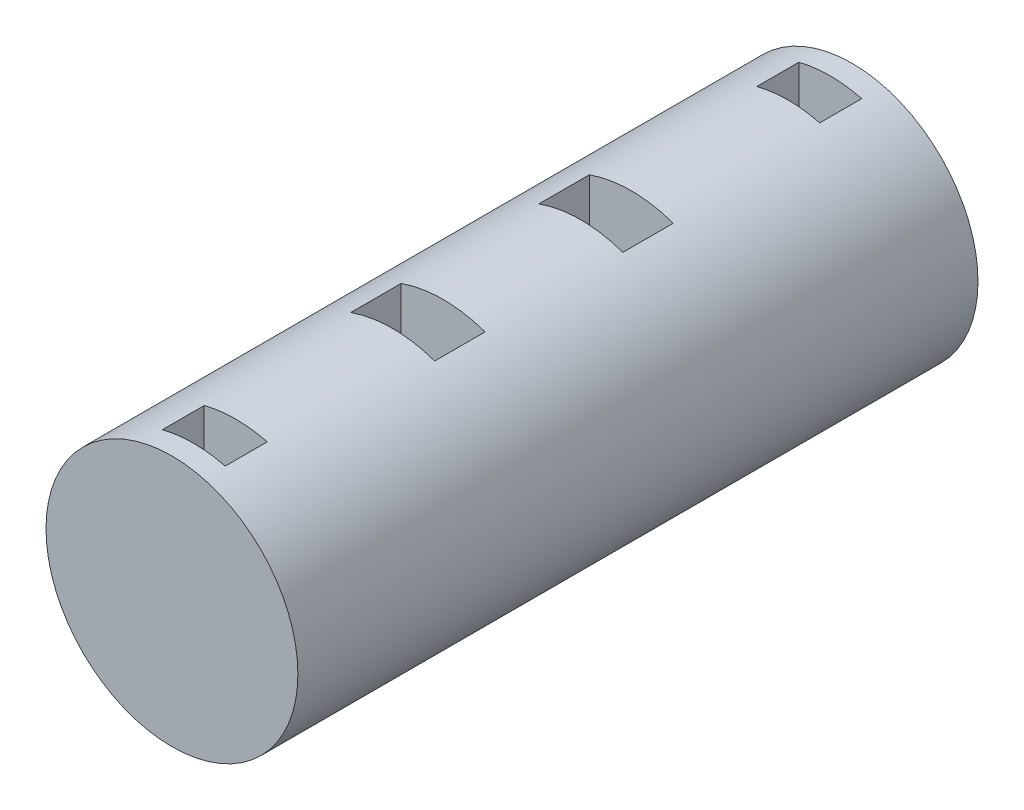
ISO-10303-21;
HEADER;
FILE_DESCRIPTION(('STEP AP214'),'2;1');
FILE_NAME('part.step','',(''),(''),'','','');
FILE_SCHEMA(('AUTOMOTIVE_DESIGN { 1 0 10303 214 1 1 1 1 }'));
ENDSEC;
DATA;
#1=APPLICATION_CONTEXT('core data for automotive mechanical design processes');
#2=APPLICATION_PROTOCOL_DEFINITION('international standard','automotive_design',2000,#1);
#3=PRODUCT_CONTEXT('',#1,'mechanical');
#4=PRODUCT('Part','Part','',(#3));
#5=PRODUCT_RELATED_PRODUCT_CATEGORY('part','',(#4));
#6=PRODUCT_DEFINITION_FORMATION('','',#4);
#7=PRODUCT_DEFINITION_CONTEXT('part definition',#1,'design');
#8=PRODUCT_DEFINITION('design','',#6,#7);
#9=PRODUCT_DEFINITION_SHAPE('','',#8);
#10=(LENGTH_UNIT() NAMED_UNIT(*) SI_UNIT(.MILLI.,.METRE.));
#11=(NAMED_UNIT(*) PLANE_ANGLE_UNIT() SI_UNIT($,.RADIAN.));
#12=(NAMED_UNIT(*) SI_UNIT($,.STERADIAN.) SOLID_ANGLE_UNIT());
#13=UNCERTAINTY_MEASURE_WITH_UNIT(LENGTH_MEASURE(1.E-05),#10,'distance_accuracy_value','');
#14=(GEOMETRIC_REPRESENTATION_CONTEXT(3) GLOBAL_UNCERTAINTY_ASSIGNED_CONTEXT((#13)) GLOBAL_UNIT_ASSIGNED_CONTEXT((#10,
#11,#12)) REPRESENTATION_CONTEXT('',''));
#15=CARTESIAN_POINT('',(0.,0.,0.));
#16=DIRECTION('',(0.,0.,1.));
#17=DIRECTION('',(1.,0.,0.));
#18=AXIS2_PLACEMENT_3D('',#15,#16,#17);
#19=CARTESIAN_POINT('',(0.,0.,81.));
#20=DIRECTION('',(0.,0.,-1.));
#21=DIRECTION('',(-1.,0.,0.));
#22=AXIS2_PLACEMENT_3D('',#19,#20,#21);
#23=CYLINDRICAL_SURFACE('',#22,30.);
#24=CARTESIAN_POINT('',(0.,0.,65.8065199589769));
#25=DIRECTION('',(0.,0.,-1.));
#26=DIRECTION('',(-1.,0.,0.));
#27=AXIS2_PLACEMENT_3D('',#24,#25,#26);
#28=CIRCLE('',#27,30.);
#29=CARTESIAN_POINT('',(-7.49999999999999,29.0473750965556,65.8065199589769));
#30=VERTEX_POINT('',#29);
#31=CARTESIAN_POINT('',(7.50000000000001,29.0473750965556,65.8065199589769));
#32=VERTEX_POINT('',#31);
#33=EDGE_CURVE('E240',#30,#32,#28,.T.);
#34=ORIENTED_EDGE('',*,*,#33,.T.);
#35=DIRECTION('',(0.,0.,-1.));
#36=VECTOR('',#35,1.);
#37=CARTESIAN_POINT('',(7.50000000000001,29.0473750965556,81.));
#38=LINE('',#37,#36);
#39=CARTESIAN_POINT('',(7.50000000000001,29.0473750965556,75.8065199589769));
#40=VERTEX_POINT('',#39);
#41=EDGE_CURVE('E11',#32,#40,#38,.F.);
#42=ORIENTED_EDGE('',*,*,#41,.T.);
#43=CARTESIAN_POINT('',(0.,0.,75.8065199589769));
#44=DIRECTION('',(0.,0.,1.));
#45=DIRECTION('',(1.,0.,0.));
#46=AXIS2_PLACEMENT_3D('',#43,#44,#45);
#47=CIRCLE('',#46,30.);
#48=CARTESIAN_POINT('',(-7.49999999999999,29.0473750965556,75.8065199589769));
#49=VERTEX_POINT('',#48);
#50=EDGE_CURVE('E49',#40,#49,#47,.T.);
#51=ORIENTED_EDGE('',*,*,#50,.T.);
#52=DIRECTION('',(0.,0.,-1.));
#53=VECTOR('',#52,1.);
#54=CARTESIAN_POINT('',(-7.49999999999999,29.0473750965556,81.));
#55=LINE('',#54,#53);
#56=EDGE_CURVE('E248',#49,#30,#55,.T.);
#57=ORIENTED_EDGE('',*,*,#56,.T.);
#58=EDGE_LOOP('',(#34,#42,#51,#57));
#59=FACE_BOUND('',#58,.T.);
#60=CARTESIAN_POINT('',(-7.49999999999999,-29.0473750965556,75.8065199589769));
#61=VERTEX_POINT('',#60);
#62=CARTESIAN_POINT('',(7.50000000000001,-29.0473750965556,75.8065199589769));
#63=VERTEX_POINT('',#62);
#64=EDGE_CURVE('E243',#61,#63,#47,.T.);
#65=ORIENTED_EDGE('',*,*,#64,.T.);
#66=DIRECTION('',(0.,0.,-1.));
#67=VECTOR('',#66,1.);
#68=CARTESIAN_POINT('',(7.50000000000001,-29.0473750965556,81.));
#69=LINE('',#68,#67);
#70=CARTESIAN_POINT('',(7.50000000000001,-29.0473750965556,65.8065199589769));
#71=VERTEX_POINT('',#70);
#72=EDGE_CURVE('E246',#63,#71,#69,.T.);
#73=ORIENTED_EDGE('',*,*,#72,.T.);
#74=CARTESIAN_POINT('',(-7.49999999999999,-29.0473750965556,65.8065199589769));
#75=VERTEX_POINT('',#74);
#76=EDGE_CURVE('E236',#71,#75,#28,.T.);
#77=ORIENTED_EDGE('',*,*,#76,.T.);
#78=DIRECTION('',(0.,0.,-1.));
#79=VECTOR('',#78,1.);
#80=CARTESIAN_POINT('',(-7.49999999999999,-29.0473750965556,81.));
#81=LINE('',#80,#79);
#82=EDGE_CURVE('E239',#75,#61,#81,.F.);
#83=ORIENTED_EDGE('',*,*,#82,.T.);
#84=EDGE_LOOP('',(#65,#73,#77,#83));
#85=FACE_BOUND('',#84,.T.);
#86=DIRECTION('',(0.,0.,-1.));
#87=VECTOR('',#86,1.);
#88=CARTESIAN_POINT('',(-10.,-28.2842712474619,81.));
#89=LINE('',#88,#87);
#90=CARTESIAN_POINT('',(-10.,-28.2842712474619,28.4117050793827));
#91=VERTEX_POINT('',#90);
#92=CARTESIAN_POINT('',(-10.,-28.2842712474619,16.4117050793827));
#93=VERTEX_POINT('',#92);
#94=EDGE_CURVE('E234',#91,#93,#89,.T.);
#95=ORIENTED_EDGE('',*,*,#94,.F.);
#96=CARTESIAN_POINT('',(0.,0.,28.4117050793827));
#97=DIRECTION('',(0.,0.,1.));
#98=DIRECTION('',(1.,0.,0.));
#99=AXIS2_PLACEMENT_3D('',#96,#97,#98);
#100=CIRCLE('',#99,30.);
#101=CARTESIAN_POINT('',(10.,-28.2842712474619,28.4117050793827));
#102=VERTEX_POINT('',#101);
#103=EDGE_CURVE('E231',#91,#102,#100,.T.);
#104=ORIENTED_EDGE('',*,*,#103,.T.);
#105=DIRECTION('',(0.,0.,-1.));
#106=VECTOR('',#105,1.);
#107=CARTESIAN_POINT('',(10.,-28.2842712474619,81.));
#108=LINE('',#107,#106);
#109=CARTESIAN_POINT('',(10.,-28.2842712474619,16.4117050793827));
#110=VERTEX_POINT('',#109);
#111=EDGE_CURVE('E230',#102,#110,#108,.T.);
#112=ORIENTED_EDGE('',*,*,#111,.T.);
#113=CARTESIAN_POINT('',(0.,0.,16.4117050793827));
#114=DIRECTION('',(0.,0.,1.));
#115=DIRECTION('',(1.,0.,0.));
#116=AXIS2_PLACEMENT_3D('',#113,#114,#115);
#117=CIRCLE('',#116,30.);
#118=EDGE_CURVE('E225',#93,#110,#117,.T.);
#119=ORIENTED_EDGE('',*,*,#118,.F.);
#120=EDGE_LOOP('',(#95,#104,#112,#119));
#121=FACE_BOUND('',#120,.T.);
#122=DIRECTION('',(0.,0.,-1.));
#123=VECTOR('',#122,1.);
#124=CARTESIAN_POINT('',(10.,28.2842712474619,81.));
#125=LINE('',#124,#123);
#126=CARTESIAN_POINT('',(10.,28.2842712474619,16.4117050793827));
#127=VERTEX_POINT('',#126);
#128=CARTESIAN_POINT('',(10.,28.2842712474619,28.4117050793827));
#129=VERTEX_POINT('',#128);
#130=EDGE_CURVE('E219',#127,#129,#125,.F.);
#131=ORIENTED_EDGE('',*,*,#130,.T.);
#132=CARTESIAN_POINT('',(-10.,28.2842712474619,28.4117050793827));
#133=VERTEX_POINT('',#132);
#134=EDGE_CURVE('E227',#129,#133,#100,.T.);
#135=ORIENTED_EDGE('',*,*,#134,.T.);
#136=DIRECTION('',(0.,0.,-1.));
#137=VECTOR('',#136,1.);
#138=CARTESIAN_POINT('',(-10.,28.2842712474619,81.));
#139=LINE('',#138,#137);
#140=CARTESIAN_POINT('',(-10.,28.2842712474619,16.4117050793827));
#141=VERTEX_POINT('',#140);
#142=EDGE_CURVE('E224',#141,#133,#139,.F.);
#143=ORIENTED_EDGE('',*,*,#142,.F.);
#144=EDGE_CURVE('E222',#127,#141,#117,.T.);
#145=ORIENTED_EDGE('',*,*,#144,.F.);
#146=EDGE_LOOP('',(#131,#135,#143,#145));
#147=FACE_BOUND('',#146,.T.);
#148=CARTESIAN_POINT('',(0.,0.,81.));
#149=DIRECTION('',(0.,0.,1.));
#150=DIRECTION('',(1.,0.,0.));
#151=AXIS2_PLACEMENT_3D('',#148,#149,#150);
#152=CIRCLE('',#151,30.);
#153=CARTESIAN_POINT('',(30.,0.,81.));
#154=VERTEX_POINT('',#153);
#155=EDGE_CURVE('E209',#154,#154,#152,.T.);
#156=ORIENTED_EDGE('',*,*,#155,.F.);
#157=EDGE_LOOP('',(#156));
#158=FACE_BOUND('',#157,.T.);
#159=CARTESIAN_POINT('',(0.,0.,-65.8065199589769));
#160=DIRECTION('',(0.,0.,-1.));
#161=DIRECTION('',(-1.,0.,0.));
#162=AXIS2_PLACEMENT_3D('',#159,#160,#161);
#163=CIRCLE('',#162,30.);
#164=CARTESIAN_POINT('',(-7.49999999999999,29.0473750965556,-65.8065199589769));
#165=VERTEX_POINT('',#164);
#166=CARTESIAN_POINT('',(7.50000000000001,29.0473750965556,-65.8065199589769));
#167=VERTEX_POINT('',#166);
#168=EDGE_CURVE('E160',#165,#167,#163,.T.);
#169=ORIENTED_EDGE('',*,*,#168,.F.);
#170=DIRECTION('',(0.,0.,1.));
#171=VECTOR('',#170,1.);
#172=CARTESIAN_POINT('',(-7.49999999999999,29.0473750965556,-81.));
#173=LINE('',#172,#171);
#174=CARTESIAN_POINT('',(-7.49999999999999,29.0473750965556,-75.8065199589769));
#175=VERTEX_POINT('',#174);
#176=EDGE_CURVE('E186',#175,#165,#173,.T.);
#177=ORIENTED_EDGE('',*,*,#176,.F.);
#178=CARTESIAN_POINT('',(0.,0.,-75.8065199589769));
#179=DIRECTION('',(0.,0.,1.));
#180=DIRECTION('',(1.,0.,0.));
#181=AXIS2_PLACEMENT_3D('',#178,#179,#180);
#182=CIRCLE('',#181,30.);
#183=CARTESIAN_POINT('',(7.50000000000001,29.0473750965556,-75.8065199589769));
#184=VERTEX_POINT('',#183);
#185=EDGE_CURVE('E188',#184,#175,#182,.T.);
#186=ORIENTED_EDGE('',*,*,#185,.F.);
#187=DIRECTION('',(0.,0.,1.));
#188=VECTOR('',#187,1.);
#189=CARTESIAN_POINT('',(7.50000000000001,29.0473750965556,-81.));
#190=LINE('',#189,#188);
#191=EDGE_CURVE('E193',#167,#184,#190,.F.);
#192=ORIENTED_EDGE('',*,*,#191,.F.);
#193=EDGE_LOOP('',(#169,#177,#186,#192));
#194=FACE_BOUND('',#193,.T.);
#195=CARTESIAN_POINT('',(-7.49999999999999,-29.0473750965556,-75.8065199589769));
#196=VERTEX_POINT('',#195);
#197=CARTESIAN_POINT('',(7.50000000000001,-29.0473750965556,-75.8065199589769));
#198=VERTEX_POINT('',#197);
#199=EDGE_CURVE('E173',#196,#198,#182,.T.);
#200=ORIENTED_EDGE('',*,*,#199,.F.);
#201=DIRECTION('',(0.,0.,1.));
#202=VECTOR('',#201,1.);
#203=CARTESIAN_POINT('',(-7.49999999999999,-29.0473750965556,-81.));
#204=LINE('',#203,#202);
#205=CARTESIAN_POINT('',(-7.49999999999999,-29.0473750965556,-65.8065199589769));
#206=VERTEX_POINT('',#205);
#207=EDGE_CURVE('E177',#206,#196,#204,.F.);
#208=ORIENTED_EDGE('',*,*,#207,.F.);
#209=CARTESIAN_POINT('',(7.50000000000001,-29.0473750965556,-65.8065199589769));
#210=VERTEX_POINT('',#209);
#211=EDGE_CURVE('E157',#210,#206,#163,.T.);
#212=ORIENTED_EDGE('',*,*,#211,.F.);
#213=DIRECTION('',(0.,0.,1.));
#214=VECTOR('',#213,1.);
#215=CARTESIAN_POINT('',(7.50000000000001,-29.0473750965556,-81.));
#216=LINE('',#215,#214);
#217=EDGE_CURVE('E167',#198,#210,#216,.T.);
#218=ORIENTED_EDGE('',*,*,#217,.F.);
#219=EDGE_LOOP('',(#200,#208,#212,#218));
#220=FACE_BOUND('',#219,.T.);
#221=DIRECTION('',(0.,0.,1.));
#222=VECTOR('',#221,1.);
#223=CARTESIAN_POINT('',(-10.,-28.2842712474619,-81.));
#224=LINE('',#223,#222);
#225=CARTESIAN_POINT('',(-10.,-28.2842712474619,-28.4117050793827));
#226=VERTEX_POINT('',#225);
#227=CARTESIAN_POINT('',(-10.,-28.2842712474619,-16.4117050793827));
#228=VERTEX_POINT('',#227);
#229=EDGE_CURVE('E182',#226,#228,#224,.T.);
#230=ORIENTED_EDGE('',*,*,#229,.T.);
#231=CARTESIAN_POINT('',(0.,0.,-16.4117050793827));
#232=DIRECTION('',(0.,0.,1.));
#233=DIRECTION('',(1.,0.,0.));
#234=AXIS2_PLACEMENT_3D('',#231,#232,#233);
#235=CIRCLE('',#234,30.);
#236=CARTESIAN_POINT('',(10.,-28.2842712474619,-16.4117050793827));
#237=VERTEX_POINT('',#236);
#238=EDGE_CURVE('E363',#228,#237,#235,.T.);
#239=ORIENTED_EDGE('',*,*,#238,.T.);
#240=DIRECTION('',(0.,0.,1.));
#241=VECTOR('',#240,1.);
#242=CARTESIAN_POINT('',(10.,-28.2842712474619,-81.));
#243=LINE('',#242,#241);
#244=CARTESIAN_POINT('',(10.,-28.2842712474619,-28.4117050793827));
#245=VERTEX_POINT('',#244);
#246=EDGE_CURVE('E367',#245,#237,#243,.T.);
#247=ORIENTED_EDGE('',*,*,#246,.F.);
#248=CARTESIAN_POINT('',(0.,0.,-28.4117050793827));
#249=DIRECTION('',(0.,0.,1.));
#250=DIRECTION('',(1.,0.,0.));
#251=AXIS2_PLACEMENT_3D('',#248,#249,#250);
#252=CIRCLE('',#251,30.);
#253=EDGE_CURVE('E178',#226,#245,#252,.T.);
#254=ORIENTED_EDGE('',*,*,#253,.F.);
#255=EDGE_LOOP('',(#230,#239,#247,#254));
#256=FACE_BOUND('',#255,.T.);
#257=DIRECTION('',(0.,0.,1.));
#258=VECTOR('',#257,1.);
#259=CARTESIAN_POINT('',(10.,28.2842712474619,-81.));
#260=LINE('',#259,#258);
#261=CARTESIAN_POINT('',(10.,28.2842712474619,-16.4117050793827));
#262=VERTEX_POINT('',#261);
#263=CARTESIAN_POINT('',(10.,28.2842712474619,-28.4117050793827));
#264=VERTEX_POINT('',#263);
#265=EDGE_CURVE('E356',#262,#264,#260,.F.);
#266=ORIENTED_EDGE('',*,*,#265,.F.);
#267=CARTESIAN_POINT('',(-10.,28.2842712474619,-16.4117050793827));
#268=VERTEX_POINT('',#267);
#269=EDGE_CURVE('E359',#262,#268,#235,.T.);
#270=ORIENTED_EDGE('',*,*,#269,.T.);
#271=DIRECTION('',(0.,0.,1.));
#272=VECTOR('',#271,1.);
#273=CARTESIAN_POINT('',(-10.,28.2842712474619,-81.));
#274=LINE('',#273,#272);
#275=CARTESIAN_POINT('',(-10.,28.2842712474619,-28.4117050793827));
#276=VERTEX_POINT('',#275);
#277=EDGE_CURVE('E362',#268,#276,#274,.F.);
#278=ORIENTED_EDGE('',*,*,#277,.T.);
#279=EDGE_CURVE('E184',#264,#276,#252,.T.);
#280=ORIENTED_EDGE('',*,*,#279,.F.);
#281=EDGE_LOOP('',(#266,#270,#278,#280));
#282=FACE_BOUND('',#281,.T.);
#283=CARTESIAN_POINT('',(0.,0.,-81.));
#284=DIRECTION('',(0.,0.,1.));
#285=DIRECTION('',(1.,0.,0.));
#286=AXIS2_PLACEMENT_3D('',#283,#284,#285);
#287=CIRCLE('',#286,30.);
#288=CARTESIAN_POINT('',(30.,0.,-81.));
#289=VERTEX_POINT('',#288);
#290=EDGE_CURVE('E350',#289,#289,#287,.T.);
#291=ORIENTED_EDGE('',*,*,#290,.T.);
#292=EDGE_LOOP('',(#291));
#293=FACE_BOUND('',#292,.T.);
#294=ADVANCED_FACE('F42',(#59,#85,#121,#147,#158,#194,#220,#256,#282,#293),#23,.T.);
#295=CARTESIAN_POINT('',(0.,0.,81.));
#296=DIRECTION('',(0.,0.,1.));
#297=DIRECTION('',(1.,0.,0.));
#298=AXIS2_PLACEMENT_3D('',#295,#296,#297);
#299=PLANE('',#298);
#300=ORIENTED_EDGE('',*,*,#155,.T.);
#301=EDGE_LOOP('',(#300));
#302=FACE_BOUND('',#301,.T.);
#303=ADVANCED_FACE('F277',(#302),#299,.T.);
#304=CARTESIAN_POINT('',(-10.,-40.5,28.4117050793827));
#305=DIRECTION('',(0.,0.,1.));
#306=DIRECTION('',(1.,0.,0.));
#307=AXIS2_PLACEMENT_3D('',#304,#305,#306);
#308=PLANE('',#307);
#309=DIRECTION('',(0.,1.,0.));
#310=VECTOR('',#309,1.);
#311=CARTESIAN_POINT('',(10.,-40.5,28.4117050793827));
#312=LINE('',#311,#310);
#313=EDGE_CURVE('E200',#102,#129,#312,.T.);
#314=ORIENTED_EDGE('',*,*,#313,.F.);
#315=ORIENTED_EDGE('',*,*,#103,.F.);
#316=DIRECTION('',(0.,1.,0.));
#317=VECTOR('',#316,1.);
#318=CARTESIAN_POINT('',(-10.,-40.5,28.4117050793827));
#319=LINE('',#318,#317);
#320=EDGE_CURVE('E206',#91,#133,#319,.T.);
#321=ORIENTED_EDGE('',*,*,#320,.T.);
#322=ORIENTED_EDGE('',*,*,#134,.F.);
#323=EDGE_LOOP('',(#314,#315,#321,#322));
#324=FACE_BOUND('',#323,.T.);
#325=ADVANCED_FACE('F283',(#324),#308,.F.);
#326=CARTESIAN_POINT('',(-10.,-40.5,28.4117050793827));
#327=DIRECTION('',(1.,0.,0.));
#328=DIRECTION('',(0.,0.,-1.));
#329=AXIS2_PLACEMENT_3D('',#326,#327,#328);
#330=PLANE('',#329);
#331=ORIENTED_EDGE('',*,*,#94,.T.);
#332=DIRECTION('',(0.,1.,0.));
#333=VECTOR('',#332,1.);
#334=CARTESIAN_POINT('',(-10.,-40.5,16.4117050793827));
#335=LINE('',#334,#333);
#336=EDGE_CURVE('E210',#93,#141,#335,.T.);
#337=ORIENTED_EDGE('',*,*,#336,.T.);
#338=ORIENTED_EDGE('',*,*,#142,.T.);
#339=ORIENTED_EDGE('',*,*,#320,.F.);
#340=EDGE_LOOP('',(#331,#337,#338,#339));
#341=FACE_BOUND('',#340,.T.);
#342=ADVANCED_FACE('F288',(#341),#330,.T.);
#343=CARTESIAN_POINT('',(-10.,-40.5,16.4117050793827));
#344=DIRECTION('',(0.,0.,1.));
#345=DIRECTION('',(1.,0.,0.));
#346=AXIS2_PLACEMENT_3D('',#343,#344,#345);
#347=PLANE('',#346);
#348=ORIENTED_EDGE('',*,*,#144,.T.);
#349=ORIENTED_EDGE('',*,*,#336,.F.);
#350=ORIENTED_EDGE('',*,*,#118,.T.);
#351=DIRECTION('',(0.,1.,0.));
#352=VECTOR('',#351,1.);
#353=CARTESIAN_POINT('',(10.,-40.5,16.4117050793827));
#354=LINE('',#353,#352);
#355=EDGE_CURVE('E213',#110,#127,#354,.T.);
#356=ORIENTED_EDGE('',*,*,#355,.T.);
#357=EDGE_LOOP('',(#348,#349,#350,#356));
#358=FACE_BOUND('',#357,.T.);
#359=ADVANCED_FACE('F294',(#358),#347,.T.);
#360=CARTESIAN_POINT('',(10.,-40.5,28.4117050793827));
#361=DIRECTION('',(1.,0.,0.));
#362=DIRECTION('',(0.,0.,-1.));
#363=AXIS2_PLACEMENT_3D('',#360,#361,#362);
#364=PLANE('',#363);
#365=ORIENTED_EDGE('',*,*,#313,.T.);
#366=ORIENTED_EDGE('',*,*,#130,.F.);
#367=ORIENTED_EDGE('',*,*,#355,.F.);
#368=ORIENTED_EDGE('',*,*,#111,.F.);
#369=EDGE_LOOP('',(#365,#366,#367,#368));
#370=FACE_BOUND('',#369,.T.);
#371=ADVANCED_FACE('F273',(#370),#364,.F.);
#372=CARTESIAN_POINT('',(7.50000000000001,-40.5,75.8065199589769));
#373=DIRECTION('',(1.,0.,0.));
#374=DIRECTION('',(0.,0.,-1.));
#375=AXIS2_PLACEMENT_3D('',#372,#373,#374);
#376=PLANE('',#375);
#377=DIRECTION('',(0.,1.,0.));
#378=VECTOR('',#377,1.);
#379=CARTESIAN_POINT('',(7.50000000000001,-40.5,75.8065199589769));
#380=LINE('',#379,#378);
#381=EDGE_CURVE('E197',#63,#40,#380,.T.);
#382=ORIENTED_EDGE('',*,*,#381,.T.);
#383=ORIENTED_EDGE('',*,*,#41,.F.);
#384=DIRECTION('',(0.,1.,0.));
#385=VECTOR('',#384,1.);
#386=CARTESIAN_POINT('',(7.50000000000001,-40.5,65.8065199589769));
#387=LINE('',#386,#385);
#388=EDGE_CURVE('E56',#71,#32,#387,.T.);
#389=ORIENTED_EDGE('',*,*,#388,.F.);
#390=ORIENTED_EDGE('',*,*,#72,.F.);
#391=EDGE_LOOP('',(#382,#383,#389,#390));
#392=FACE_BOUND('',#391,.T.);
#393=ADVANCED_FACE('F260',(#392),#376,.F.);
#394=CARTESIAN_POINT('',(-7.49999999999999,-40.5,75.8065199589769));
#395=DIRECTION('',(0.,0.,1.));
#396=DIRECTION('',(1.,0.,0.));
#397=AXIS2_PLACEMENT_3D('',#394,#395,#396);
#398=PLANE('',#397);
#399=ORIENTED_EDGE('',*,*,#381,.F.);
#400=ORIENTED_EDGE('',*,*,#64,.F.);
#401=DIRECTION('',(0.,1.,0.));
#402=VECTOR('',#401,1.);
#403=CARTESIAN_POINT('',(-7.49999999999999,-40.5,75.8065199589769));
#404=LINE('',#403,#402);
#405=EDGE_CURVE('E201',#61,#49,#404,.T.);
#406=ORIENTED_EDGE('',*,*,#405,.T.);
#407=ORIENTED_EDGE('',*,*,#50,.F.);
#408=EDGE_LOOP('',(#399,#400,#406,#407));
#409=FACE_BOUND('',#408,.T.);
#410=ADVANCED_FACE('F263',(#409),#398,.F.);
#411=CARTESIAN_POINT('',(-7.49999999999999,-40.5,75.8065199589769));
#412=DIRECTION('',(-1.,0.,0.));
#413=DIRECTION('',(0.,0.,1.));
#414=AXIS2_PLACEMENT_3D('',#411,#412,#413);
#415=PLANE('',#414);
#416=ORIENTED_EDGE('',*,*,#405,.F.);
#417=ORIENTED_EDGE('',*,*,#82,.F.);
#418=DIRECTION('',(0.,1.,0.));
#419=VECTOR('',#418,1.);
#420=CARTESIAN_POINT('',(-7.49999999999999,-40.5,65.8065199589769));
#421=LINE('',#420,#419);
#422=EDGE_CURVE('E61',#75,#30,#421,.T.);
#423=ORIENTED_EDGE('',*,*,#422,.T.);
#424=ORIENTED_EDGE('',*,*,#56,.F.);
#425=EDGE_LOOP('',(#416,#417,#423,#424));
#426=FACE_BOUND('',#425,.T.);
#427=ADVANCED_FACE('F257',(#426),#415,.F.);
#428=CARTESIAN_POINT('',(-7.49999999999999,-40.5,65.8065199589769));
#429=DIRECTION('',(0.,0.,-1.));
#430=DIRECTION('',(-1.,0.,0.));
#431=AXIS2_PLACEMENT_3D('',#428,#429,#430);
#432=PLANE('',#431);
#433=ORIENTED_EDGE('',*,*,#422,.F.);
#434=ORIENTED_EDGE('',*,*,#76,.F.);
#435=ORIENTED_EDGE('',*,*,#388,.T.);
#436=ORIENTED_EDGE('',*,*,#33,.F.);
#437=EDGE_LOOP('',(#433,#434,#435,#436));
#438=FACE_BOUND('',#437,.T.);
#439=ADVANCED_FACE('F254',(#438),#432,.F.);
#440=CARTESIAN_POINT('',(0.,0.,-81.));
#441=DIRECTION('',(0.,0.,-1.));
#442=DIRECTION('',(1.,0.,0.));
#443=AXIS2_PLACEMENT_3D('',#440,#441,#442);
#444=PLANE('',#443);
#445=ORIENTED_EDGE('',*,*,#290,.F.);
#446=EDGE_LOOP('',(#445));
#447=FACE_BOUND('',#446,.T.);
#448=ADVANCED_FACE('F302',(#447),#444,.T.);
#449=CARTESIAN_POINT('',(-10.,-40.5,-28.4117050793827));
#450=DIRECTION('',(0.,0.,-1.));
#451=DIRECTION('',(1.,0.,0.));
#452=AXIS2_PLACEMENT_3D('',#449,#450,#451);
#453=PLANE('',#452);
#454=DIRECTION('',(0.,1.,0.));
#455=VECTOR('',#454,1.);
#456=CARTESIAN_POINT('',(10.,-40.5,-28.4117050793827));
#457=LINE('',#456,#455);
#458=EDGE_CURVE('E339',#245,#264,#457,.T.);
#459=ORIENTED_EDGE('',*,*,#458,.T.);
#460=ORIENTED_EDGE('',*,*,#279,.T.);
#461=DIRECTION('',(0.,1.,0.));
#462=VECTOR('',#461,1.);
#463=CARTESIAN_POINT('',(-10.,-40.5,-28.4117050793827));
#464=LINE('',#463,#462);
#465=EDGE_CURVE('E348',#226,#276,#464,.T.);
#466=ORIENTED_EDGE('',*,*,#465,.F.);
#467=ORIENTED_EDGE('',*,*,#253,.T.);
#468=EDGE_LOOP('',(#459,#460,#466,#467));
#469=FACE_BOUND('',#468,.T.);
#470=ADVANCED_FACE('F305',(#469),#453,.F.);
#471=CARTESIAN_POINT('',(-10.,-40.5,-28.4117050793827));
#472=DIRECTION('',(1.,0.,0.));
#473=DIRECTION('',(0.,0.,1.));
#474=AXIS2_PLACEMENT_3D('',#471,#472,#473);
#475=PLANE('',#474);
#476=ORIENTED_EDGE('',*,*,#229,.F.);
#477=ORIENTED_EDGE('',*,*,#465,.T.);
#478=ORIENTED_EDGE('',*,*,#277,.F.);
#479=DIRECTION('',(0.,1.,0.));
#480=VECTOR('',#479,1.);
#481=CARTESIAN_POINT('',(-10.,-40.5,-16.4117050793827));
#482=LINE('',#481,#480);
#483=EDGE_CURVE('E351',#228,#268,#482,.T.);
#484=ORIENTED_EDGE('',*,*,#483,.F.);
#485=EDGE_LOOP('',(#476,#477,#478,#484));
#486=FACE_BOUND('',#485,.T.);
#487=ADVANCED_FACE('F310',(#486),#475,.T.);
#488=CARTESIAN_POINT('',(-10.,-40.5,-16.4117050793827));
#489=DIRECTION('',(0.,0.,-1.));
#490=DIRECTION('',(1.,0.,0.));
#491=AXIS2_PLACEMENT_3D('',#488,#489,#490);
#492=PLANE('',#491);
#493=ORIENTED_EDGE('',*,*,#269,.F.);
#494=DIRECTION('',(0.,1.,0.));
#495=VECTOR('',#494,1.);
#496=CARTESIAN_POINT('',(10.,-40.5,-16.4117050793827));
#497=LINE('',#496,#495);
#498=EDGE_CURVE('E343',#237,#262,#497,.T.);
#499=ORIENTED_EDGE('',*,*,#498,.F.);
#500=ORIENTED_EDGE('',*,*,#238,.F.);
#501=ORIENTED_EDGE('',*,*,#483,.T.);
#502=EDGE_LOOP('',(#493,#499,#500,#501));
#503=FACE_BOUND('',#502,.T.);
#504=ADVANCED_FACE('F318',(#503),#492,.T.);
#505=CARTESIAN_POINT('',(10.,-40.5,-28.4117050793827));
#506=DIRECTION('',(1.,0.,0.));
#507=DIRECTION('',(0.,0.,1.));
#508=AXIS2_PLACEMENT_3D('',#505,#506,#507);
#509=PLANE('',#508);
#510=ORIENTED_EDGE('',*,*,#458,.F.);
#511=ORIENTED_EDGE('',*,*,#246,.T.);
#512=ORIENTED_EDGE('',*,*,#498,.T.);
#513=ORIENTED_EDGE('',*,*,#265,.T.);
#514=EDGE_LOOP('',(#510,#511,#512,#513));
#515=FACE_BOUND('',#514,.T.);
#516=ADVANCED_FACE('F315',(#515),#509,.F.);
#517=CARTESIAN_POINT('',(7.50000000000001,-40.5,-75.8065199589769));
#518=DIRECTION('',(1.,0.,0.));
#519=DIRECTION('',(0.,0.,1.));
#520=AXIS2_PLACEMENT_3D('',#517,#518,#519);
#521=PLANE('',#520);
#522=DIRECTION('',(0.,1.,0.));
#523=VECTOR('',#522,1.);
#524=CARTESIAN_POINT('',(7.50000000000001,-40.5,-75.8065199589769));
#525=LINE('',#524,#523);
#526=EDGE_CURVE('E169',#198,#184,#525,.T.);
#527=ORIENTED_EDGE('',*,*,#526,.F.);
#528=ORIENTED_EDGE('',*,*,#217,.T.);
#529=DIRECTION('',(0.,1.,0.));
#530=VECTOR('',#529,1.);
#531=CARTESIAN_POINT('',(7.50000000000001,-40.5,-65.8065199589769));
#532=LINE('',#531,#530);
#533=EDGE_CURVE('E153',#210,#167,#532,.T.);
#534=ORIENTED_EDGE('',*,*,#533,.T.);
#535=ORIENTED_EDGE('',*,*,#191,.T.);
#536=EDGE_LOOP('',(#527,#528,#534,#535));
#537=FACE_BOUND('',#536,.T.);
#538=ADVANCED_FACE('F168',(#537),#521,.F.);
#539=CARTESIAN_POINT('',(-7.49999999999999,-40.5,-75.8065199589769));
#540=DIRECTION('',(0.,0.,-1.));
#541=DIRECTION('',(1.,0.,0.));
#542=AXIS2_PLACEMENT_3D('',#539,#540,#541);
#543=PLANE('',#542);
#544=ORIENTED_EDGE('',*,*,#526,.T.);
#545=ORIENTED_EDGE('',*,*,#185,.T.);
#546=DIRECTION('',(0.,1.,0.));
#547=VECTOR('',#546,1.);
#548=CARTESIAN_POINT('',(-7.49999999999999,-40.5,-75.8065199589769));
#549=LINE('',#548,#547);
#550=EDGE_CURVE('E340',#196,#175,#549,.T.);
#551=ORIENTED_EDGE('',*,*,#550,.F.);
#552=ORIENTED_EDGE('',*,*,#199,.T.);
#553=EDGE_LOOP('',(#544,#545,#551,#552));
#554=FACE_BOUND('',#553,.T.);
#555=ADVANCED_FACE('F328',(#554),#543,.F.);
#556=CARTESIAN_POINT('',(-7.49999999999999,-40.5,-75.8065199589769));
#557=DIRECTION('',(-1.,0.,0.));
#558=DIRECTION('',(0.,0.,-1.));
#559=AXIS2_PLACEMENT_3D('',#556,#557,#558);
#560=PLANE('',#559);
#561=ORIENTED_EDGE('',*,*,#550,.T.);
#562=ORIENTED_EDGE('',*,*,#176,.T.);
#563=DIRECTION('',(0.,1.,0.));
#564=VECTOR('',#563,1.);
#565=CARTESIAN_POINT('',(-7.49999999999999,-40.5,-65.8065199589769));
#566=LINE('',#565,#564);
#567=EDGE_CURVE('E164',#206,#165,#566,.T.);
#568=ORIENTED_EDGE('',*,*,#567,.F.);
#569=ORIENTED_EDGE('',*,*,#207,.T.);
#570=EDGE_LOOP('',(#561,#562,#568,#569));
#571=FACE_BOUND('',#570,.T.);
#572=ADVANCED_FACE('F331',(#571),#560,.F.);
#573=CARTESIAN_POINT('',(-7.49999999999999,-40.5,-65.8065199589769));
#574=DIRECTION('',(0.,0.,1.));
#575=DIRECTION('',(-1.,0.,0.));
#576=AXIS2_PLACEMENT_3D('',#573,#574,#575);
#577=PLANE('',#576);
#578=ORIENTED_EDGE('',*,*,#567,.T.);
#579=ORIENTED_EDGE('',*,*,#168,.T.);
#580=ORIENTED_EDGE('',*,*,#533,.F.);
#581=ORIENTED_EDGE('',*,*,#211,.T.);
#582=EDGE_LOOP('',(#578,#579,#580,#581));
#583=FACE_BOUND('',#582,.T.);
#584=ADVANCED_FACE('F155',(#583),#577,.F.);
#585=CLOSED_SHELL('',(#294,#303,#325,#342,#359,#371,#393,#410,#427,#439,#448,#470,#487,#504,
#516,#538,#555,#572,#584));
#586=MANIFOLD_SOLID_BREP('B2',#585);
#587=ADVANCED_BREP_SHAPE_REPRESENTATION('',(#18,#586),#14);
#588=SHAPE_DEFINITION_REPRESENTATION(#9,#587);
ENDSEC;
END-ISO-10303-21;
